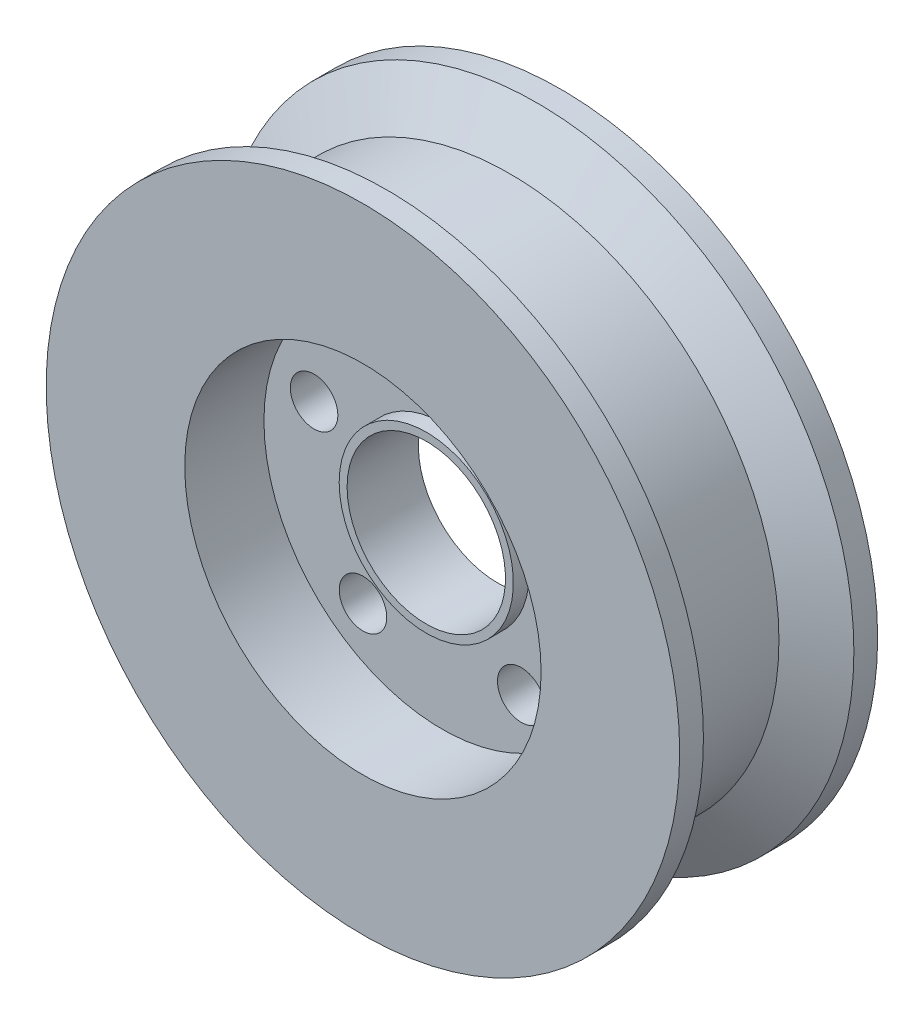
ISO-10303-21;
HEADER;
FILE_DESCRIPTION(('STEP AP214'),'2;1');
FILE_NAME('part.step','',(''),(''),'','','');
FILE_SCHEMA(('AUTOMOTIVE_DESIGN { 1 0 10303 214 1 1 1 1 }'));
ENDSEC;
DATA;
#1=APPLICATION_CONTEXT('core data for automotive mechanical design processes');
#2=APPLICATION_PROTOCOL_DEFINITION('international standard','automotive_design',2000,#1);
#3=PRODUCT_CONTEXT('',#1,'mechanical');
#4=PRODUCT('Part','Part','',(#3));
#5=PRODUCT_RELATED_PRODUCT_CATEGORY('part','',(#4));
#6=PRODUCT_DEFINITION_FORMATION('','',#4);
#7=PRODUCT_DEFINITION_CONTEXT('part definition',#1,'design');
#8=PRODUCT_DEFINITION('design','',#6,#7);
#9=PRODUCT_DEFINITION_SHAPE('','',#8);
#10=(LENGTH_UNIT() NAMED_UNIT(*) SI_UNIT(.MILLI.,.METRE.));
#11=(NAMED_UNIT(*) PLANE_ANGLE_UNIT() SI_UNIT($,.RADIAN.));
#12=(NAMED_UNIT(*) SI_UNIT($,.STERADIAN.) SOLID_ANGLE_UNIT());
#13=UNCERTAINTY_MEASURE_WITH_UNIT(LENGTH_MEASURE(1.E-05),#10,'distance_accuracy_value','');
#14=(GEOMETRIC_REPRESENTATION_CONTEXT(3) GLOBAL_UNCERTAINTY_ASSIGNED_CONTEXT((#13)) GLOBAL_UNIT_ASSIGNED_CONTEXT((#10,
#11,#12)) REPRESENTATION_CONTEXT('',''));
#15=CARTESIAN_POINT('',(0.,0.,0.));
#16=DIRECTION('',(0.,0.,1.));
#17=DIRECTION('',(1.,0.,0.));
#18=AXIS2_PLACEMENT_3D('',#15,#16,#17);
#19=CARTESIAN_POINT('',(0.,0.,12.5));
#20=DIRECTION('',(0.,0.,-1.));
#21=DIRECTION('',(-1.,0.,0.));
#22=AXIS2_PLACEMENT_3D('',#19,#20,#21);
#23=CYLINDRICAL_SURFACE('',#22,40.);
#24=CARTESIAN_POINT('',(0.,0.,-12.5));
#25=DIRECTION('',(0.,0.,1.));
#26=DIRECTION('',(1.,0.,0.));
#27=AXIS2_PLACEMENT_3D('',#24,#25,#26);
#28=CIRCLE('',#27,40.);
#29=CARTESIAN_POINT('',(40.,0.,-12.5));
#30=VERTEX_POINT('',#29);
#31=EDGE_CURVE('E93',#30,#30,#28,.T.);
#32=ORIENTED_EDGE('',*,*,#31,.T.);
#33=EDGE_LOOP('',(#32));
#34=FACE_BOUND('',#33,.T.);
#35=CARTESIAN_POINT('',(0.,0.,-9.5));
#36=DIRECTION('',(0.,0.,1.));
#37=DIRECTION('',(1.,0.,0.));
#38=AXIS2_PLACEMENT_3D('',#35,#36,#37);
#39=CIRCLE('',#38,40.);
#40=CARTESIAN_POINT('',(40.,0.,-9.5));
#41=VERTEX_POINT('',#40);
#42=EDGE_CURVE('E158',#41,#41,#39,.T.);
#43=ORIENTED_EDGE('',*,*,#42,.F.);
#44=EDGE_LOOP('',(#43));
#45=FACE_BOUND('',#44,.T.);
#46=ADVANCED_FACE('F39',(#34,#45),#23,.T.);
#47=CARTESIAN_POINT('',(0.,0.,12.5));
#48=DIRECTION('',(0.,0.,1.));
#49=DIRECTION('',(1.,0.,0.));
#50=AXIS2_PLACEMENT_3D('',#47,#48,#49);
#51=CIRCLE('',#50,40.);
#52=CARTESIAN_POINT('',(40.,0.,12.5));
#53=VERTEX_POINT('',#52);
#54=EDGE_CURVE('E52',#53,#53,#51,.T.);
#55=ORIENTED_EDGE('',*,*,#54,.F.);
#56=EDGE_LOOP('',(#55));
#57=FACE_BOUND('',#56,.T.);
#58=CARTESIAN_POINT('',(0.,0.,9.5));
#59=DIRECTION('',(0.,0.,1.));
#60=DIRECTION('',(1.,0.,0.));
#61=AXIS2_PLACEMENT_3D('',#58,#59,#60);
#62=CIRCLE('',#61,40.);
#63=CARTESIAN_POINT('',(40.,0.,9.5));
#64=VERTEX_POINT('',#63);
#65=EDGE_CURVE('E241',#64,#64,#62,.T.);
#66=ORIENTED_EDGE('',*,*,#65,.T.);
#67=EDGE_LOOP('',(#66));
#68=FACE_BOUND('',#67,.T.);
#69=ADVANCED_FACE('F155',(#57,#68),#23,.T.);
#70=CARTESIAN_POINT('',(0.,0.,12.5));
#71=DIRECTION('',(0.,0.,1.));
#72=DIRECTION('',(1.,0.,0.));
#73=AXIS2_PLACEMENT_3D('',#70,#71,#72);
#74=PLANE('',#73);
#75=CARTESIAN_POINT('',(0.,0.,12.5));
#76=DIRECTION('',(0.,0.,1.));
#77=DIRECTION('',(1.,0.,0.));
#78=AXIS2_PLACEMENT_3D('',#75,#76,#77);
#79=CIRCLE('',#78,22.5);
#80=CARTESIAN_POINT('',(22.5,0.,12.5));
#81=VERTEX_POINT('',#80);
#82=EDGE_CURVE('E84',#81,#81,#79,.T.);
#83=ORIENTED_EDGE('',*,*,#82,.F.);
#84=EDGE_LOOP('',(#83));
#85=FACE_BOUND('',#84,.T.);
#86=ORIENTED_EDGE('',*,*,#54,.T.);
#87=EDGE_LOOP('',(#86));
#88=FACE_BOUND('',#87,.T.);
#89=ADVANCED_FACE('F150',(#85,#88),#74,.T.);
#90=CARTESIAN_POINT('',(0.,0.,-12.5));
#91=DIRECTION('',(0.,0.,1.));
#92=DIRECTION('',(1.,0.,0.));
#93=AXIS2_PLACEMENT_3D('',#90,#91,#92);
#94=PLANE('',#93);
#95=CARTESIAN_POINT('',(0.,0.,-12.5));
#96=DIRECTION('',(0.,0.,1.));
#97=DIRECTION('',(1.,0.,0.));
#98=AXIS2_PLACEMENT_3D('',#95,#96,#97);
#99=CIRCLE('',#98,22.5);
#100=CARTESIAN_POINT('',(22.5,0.,-12.5));
#101=VERTEX_POINT('',#100);
#102=EDGE_CURVE('E85',#101,#101,#99,.T.);
#103=ORIENTED_EDGE('',*,*,#102,.T.);
#104=EDGE_LOOP('',(#103));
#105=FACE_BOUND('',#104,.T.);
#106=ORIENTED_EDGE('',*,*,#31,.F.);
#107=EDGE_LOOP('',(#106));
#108=FACE_BOUND('',#107,.T.);
#109=ADVANCED_FACE('F146',(#105,#108),#94,.F.);
#110=CARTESIAN_POINT('',(0.,0.,2.5));
#111=DIRECTION('',(0.,0.,1.));
#112=DIRECTION('',(1.,0.,0.));
#113=AXIS2_PLACEMENT_3D('',#110,#111,#112);
#114=CYLINDRICAL_SURFACE('',#113,22.5);
#115=CARTESIAN_POINT('',(0.,0.,2.5));
#116=DIRECTION('',(0.,0.,1.));
#117=DIRECTION('',(1.,0.,0.));
#118=AXIS2_PLACEMENT_3D('',#115,#116,#117);
#119=CIRCLE('',#118,22.5);
#120=CARTESIAN_POINT('',(22.5,0.,2.5));
#121=VERTEX_POINT('',#120);
#122=EDGE_CURVE('E89',#121,#121,#119,.T.);
#123=ORIENTED_EDGE('',*,*,#122,.F.);
#124=EDGE_LOOP('',(#123));
#125=FACE_BOUND('',#124,.T.);
#126=ORIENTED_EDGE('',*,*,#82,.T.);
#127=EDGE_LOOP('',(#126));
#128=FACE_BOUND('',#127,.T.);
#129=ADVANCED_FACE('F149',(#125,#128),#114,.F.);
#130=CARTESIAN_POINT('',(0.,0.,2.5));
#131=DIRECTION('',(0.,0.,1.));
#132=DIRECTION('',(1.,0.,0.));
#133=AXIS2_PLACEMENT_3D('',#130,#131,#132);
#134=PLANE('',#133);
#135=CARTESIAN_POINT('',(0.,0.,2.5));
#136=DIRECTION('',(0.,0.,1.));
#137=DIRECTION('',(1.,0.,0.));
#138=AXIS2_PLACEMENT_3D('',#135,#136,#137);
#139=CIRCLE('',#138,11.);
#140=CARTESIAN_POINT('',(11.,0.,2.5));
#141=VERTEX_POINT('',#140);
#142=EDGE_CURVE('E10',#141,#141,#139,.T.);
#143=ORIENTED_EDGE('',*,*,#142,.F.);
#144=EDGE_LOOP('',(#143));
#145=FACE_BOUND('',#144,.T.);
#146=CARTESIAN_POINT('',(-16.1679607770176,5.25328890437406,2.5));
#147=DIRECTION('',(0.,0.,1.));
#148=DIRECTION('',(0.309016994374945,0.951056516295155,0.));
#149=AXIS2_PLACEMENT_3D('',#146,#147,#148);
#150=CIRCLE('',#149,3.);
#151=CARTESIAN_POINT('',(-13.1679607770176,5.25328890437406,2.5));
#152=VERTEX_POINT('',#151);
#153=EDGE_CURVE('E57',#152,#152,#150,.T.);
#154=ORIENTED_EDGE('',*,*,#153,.F.);
#155=EDGE_LOOP('',(#154));
#156=FACE_BOUND('',#155,.T.);
#157=CARTESIAN_POINT('',(-9.99234928897197,-13.7532889043742,2.5));
#158=DIRECTION('',(0.,0.,1.));
#159=DIRECTION('',(-0.809016994374951,0.587785252292469,0.));
#160=AXIS2_PLACEMENT_3D('',#157,#158,#159);
#161=CIRCLE('',#160,3.);
#162=CARTESIAN_POINT('',(-6.99234928897197,-13.7532889043742,2.5));
#163=VERTEX_POINT('',#162);
#164=EDGE_CURVE('E62',#163,#163,#161,.T.);
#165=ORIENTED_EDGE('',*,*,#164,.F.);
#166=EDGE_LOOP('',(#165));
#167=FACE_BOUND('',#166,.T.);
#168=CARTESIAN_POINT('',(9.99234928897216,-13.753288904374,2.5));
#169=DIRECTION('',(0.,0.,1.));
#170=DIRECTION('',(-0.809016994374942,-0.58778525229248,0.));
#171=AXIS2_PLACEMENT_3D('',#168,#169,#170);
#172=CIRCLE('',#171,3.);
#173=CARTESIAN_POINT('',(12.9923492889722,-13.753288904374,2.5));
#174=VERTEX_POINT('',#173);
#175=EDGE_CURVE('E66',#174,#174,#172,.T.);
#176=ORIENTED_EDGE('',*,*,#175,.F.);
#177=EDGE_LOOP('',(#176));
#178=FACE_BOUND('',#177,.T.);
#179=CARTESIAN_POINT('',(16.1679607770176,5.25328890437429,2.5));
#180=DIRECTION('',(0.,0.,1.));
#181=DIRECTION('',(0.309016994374958,-0.95105651629515,0.));
#182=AXIS2_PLACEMENT_3D('',#179,#180,#181);
#183=CIRCLE('',#182,3.);
#184=CARTESIAN_POINT('',(19.1679607770176,5.25328890437429,2.5));
#185=VERTEX_POINT('',#184);
#186=EDGE_CURVE('E70',#185,#185,#183,.T.);
#187=ORIENTED_EDGE('',*,*,#186,.F.);
#188=EDGE_LOOP('',(#187));
#189=FACE_BOUND('',#188,.T.);
#190=CARTESIAN_POINT('',(0.,17.,2.5));
#191=DIRECTION('',(0.,0.,1.));
#192=DIRECTION('',(1.,0.,0.));
#193=AXIS2_PLACEMENT_3D('',#190,#191,#192);
#194=CIRCLE('',#193,3.);
#195=CARTESIAN_POINT('',(3.,17.,2.5));
#196=VERTEX_POINT('',#195);
#197=EDGE_CURVE('E74',#196,#196,#194,.T.);
#198=ORIENTED_EDGE('',*,*,#197,.F.);
#199=EDGE_LOOP('',(#198));
#200=FACE_BOUND('',#199,.T.);
#201=ORIENTED_EDGE('',*,*,#122,.T.);
#202=EDGE_LOOP('',(#201));
#203=FACE_BOUND('',#202,.T.);
#204=ADVANCED_FACE('F142',(#145,#156,#167,#178,#189,#200,#203),#134,.T.);
#205=CARTESIAN_POINT('',(0.,0.,-2.5));
#206=DIRECTION('',(0.,0.,-1.));
#207=DIRECTION('',(-1.,0.,0.));
#208=AXIS2_PLACEMENT_3D('',#205,#206,#207);
#209=CYLINDRICAL_SURFACE('',#208,22.5);
#210=CARTESIAN_POINT('',(0.,0.,-2.5));
#211=DIRECTION('',(0.,0.,1.));
#212=DIRECTION('',(1.,0.,0.));
#213=AXIS2_PLACEMENT_3D('',#210,#211,#212);
#214=CIRCLE('',#213,22.5);
#215=CARTESIAN_POINT('',(22.5,0.,-2.5));
#216=VERTEX_POINT('',#215);
#217=EDGE_CURVE('E80',#216,#216,#214,.T.);
#218=ORIENTED_EDGE('',*,*,#217,.T.);
#219=EDGE_LOOP('',(#218));
#220=FACE_BOUND('',#219,.T.);
#221=ORIENTED_EDGE('',*,*,#102,.F.);
#222=EDGE_LOOP('',(#221));
#223=FACE_BOUND('',#222,.T.);
#224=ADVANCED_FACE('F127',(#220,#223),#209,.F.);
#225=CARTESIAN_POINT('',(0.,0.,-2.5));
#226=DIRECTION('',(0.,0.,-1.));
#227=DIRECTION('',(1.,0.,0.));
#228=AXIS2_PLACEMENT_3D('',#225,#226,#227);
#229=PLANE('',#228);
#230=CARTESIAN_POINT('',(0.,0.,-2.5));
#231=DIRECTION('',(0.,0.,-1.));
#232=DIRECTION('',(-1.,0.,0.));
#233=AXIS2_PLACEMENT_3D('',#230,#231,#232);
#234=CIRCLE('',#233,11.);
#235=CARTESIAN_POINT('',(-11.,0.,-2.5));
#236=VERTEX_POINT('',#235);
#237=EDGE_CURVE('E42',#236,#236,#234,.T.);
#238=ORIENTED_EDGE('',*,*,#237,.F.);
#239=EDGE_LOOP('',(#238));
#240=FACE_BOUND('',#239,.T.);
#241=CARTESIAN_POINT('',(-16.1679607770176,5.25328890437406,-2.5));
#242=DIRECTION('',(0.,0.,-1.));
#243=DIRECTION('',(-1.,0.,0.));
#244=AXIS2_PLACEMENT_3D('',#241,#242,#243);
#245=CIRCLE('',#244,3.);
#246=CARTESIAN_POINT('',(-13.1679607770176,5.25328890437406,-2.5));
#247=VERTEX_POINT('',#246);
#248=EDGE_CURVE('E79',#247,#247,#245,.T.);
#249=ORIENTED_EDGE('',*,*,#248,.F.);
#250=EDGE_LOOP('',(#249));
#251=FACE_BOUND('',#250,.T.);
#252=CARTESIAN_POINT('',(-9.99234928897197,-13.7532889043742,-2.5));
#253=DIRECTION('',(0.,0.,-1.));
#254=DIRECTION('',(-1.,0.,0.));
#255=AXIS2_PLACEMENT_3D('',#252,#253,#254);
#256=CIRCLE('',#255,3.);
#257=CARTESIAN_POINT('',(-6.99234928897197,-13.7532889043742,-2.5));
#258=VERTEX_POINT('',#257);
#259=EDGE_CURVE('E113',#258,#258,#256,.T.);
#260=ORIENTED_EDGE('',*,*,#259,.F.);
#261=EDGE_LOOP('',(#260));
#262=FACE_BOUND('',#261,.T.);
#263=CARTESIAN_POINT('',(9.99234928897216,-13.753288904374,-2.5));
#264=DIRECTION('',(0.,0.,-1.));
#265=DIRECTION('',(-1.,0.,0.));
#266=AXIS2_PLACEMENT_3D('',#263,#264,#265);
#267=CIRCLE('',#266,3.);
#268=CARTESIAN_POINT('',(12.9923492889722,-13.753288904374,-2.5));
#269=VERTEX_POINT('',#268);
#270=EDGE_CURVE('E109',#269,#269,#267,.T.);
#271=ORIENTED_EDGE('',*,*,#270,.F.);
#272=EDGE_LOOP('',(#271));
#273=FACE_BOUND('',#272,.T.);
#274=CARTESIAN_POINT('',(16.1679607770176,5.25328890437429,-2.5));
#275=DIRECTION('',(0.,0.,-1.));
#276=DIRECTION('',(-1.,0.,0.));
#277=AXIS2_PLACEMENT_3D('',#274,#275,#276);
#278=CIRCLE('',#277,3.);
#279=CARTESIAN_POINT('',(19.1679607770176,5.25328890437429,-2.5));
#280=VERTEX_POINT('',#279);
#281=EDGE_CURVE('E61',#280,#280,#278,.T.);
#282=ORIENTED_EDGE('',*,*,#281,.F.);
#283=EDGE_LOOP('',(#282));
#284=FACE_BOUND('',#283,.T.);
#285=CARTESIAN_POINT('',(0.,17.,-2.5));
#286=DIRECTION('',(0.,0.,-1.));
#287=DIRECTION('',(-1.,0.,0.));
#288=AXIS2_PLACEMENT_3D('',#285,#286,#287);
#289=CIRCLE('',#288,3.);
#290=CARTESIAN_POINT('',(3.,17.,-2.5));
#291=VERTEX_POINT('',#290);
#292=EDGE_CURVE('E78',#291,#291,#289,.T.);
#293=ORIENTED_EDGE('',*,*,#292,.F.);
#294=EDGE_LOOP('',(#293));
#295=FACE_BOUND('',#294,.T.);
#296=ORIENTED_EDGE('',*,*,#217,.F.);
#297=EDGE_LOOP('',(#296));
#298=FACE_BOUND('',#297,.T.);
#299=ADVANCED_FACE('F123',(#240,#251,#262,#273,#284,#295,#298),#229,.T.);
#300=CARTESIAN_POINT('',(0.,17.,-12.5));
#301=DIRECTION('',(0.,0.,1.));
#302=DIRECTION('',(1.,0.,0.));
#303=AXIS2_PLACEMENT_3D('',#300,#301,#302);
#304=CYLINDRICAL_SURFACE('',#303,3.);
#305=CARTESIAN_POINT('',(3.,17.,-2.5));
#306=CARTESIAN_POINT('',(3.,17.,-2.44791666666667));
#307=CARTESIAN_POINT('',(3.,17.,-2.39583333333333));
#308=CARTESIAN_POINT('',(3.,17.,-2.29166666666667));
#309=CARTESIAN_POINT('',(3.,17.,-2.23958333333333));
#310=CARTESIAN_POINT('',(3.,17.,-2.13541666666667));
#311=CARTESIAN_POINT('',(3.,17.,-2.08333333333333));
#312=CARTESIAN_POINT('',(3.,17.,-1.97916666666667));
#313=CARTESIAN_POINT('',(3.,17.,-1.92708333333333));
#314=CARTESIAN_POINT('',(3.,17.,-1.82291666666667));
#315=CARTESIAN_POINT('',(3.,17.,-1.77083333333333));
#316=CARTESIAN_POINT('',(3.,17.,-1.66666666666667));
#317=CARTESIAN_POINT('',(3.,17.,-1.61458333333333));
#318=CARTESIAN_POINT('',(3.,17.,-1.51041666666667));
#319=CARTESIAN_POINT('',(3.,17.,-1.45833333333333));
#320=CARTESIAN_POINT('',(3.,17.,-1.35416666666667));
#321=CARTESIAN_POINT('',(3.,17.,-1.30208333333333));
#322=CARTESIAN_POINT('',(3.,17.,-1.19791666666667));
#323=CARTESIAN_POINT('',(3.,17.,-1.14583333333333));
#324=CARTESIAN_POINT('',(3.,17.,-1.04166666666667));
#325=CARTESIAN_POINT('',(3.,17.,-0.989583333333334));
#326=CARTESIAN_POINT('',(3.,17.,-0.885416666666668));
#327=CARTESIAN_POINT('',(3.,17.,-0.833333333333334));
#328=CARTESIAN_POINT('',(3.,17.,-0.729166666666667));
#329=CARTESIAN_POINT('',(3.,17.,-0.677083333333334));
#330=CARTESIAN_POINT('',(3.,17.,-0.572916666666667));
#331=CARTESIAN_POINT('',(3.,17.,-0.520833333333334));
#332=CARTESIAN_POINT('',(3.,17.,-0.416666666666667));
#333=CARTESIAN_POINT('',(3.,17.,-0.364583333333334));
#334=CARTESIAN_POINT('',(3.,17.,-0.260416666666667));
#335=CARTESIAN_POINT('',(3.,17.,-0.208333333333334));
#336=CARTESIAN_POINT('',(3.,17.,-0.104166666666667));
#337=CARTESIAN_POINT('',(3.,17.,-0.0520833333333334));
#338=CARTESIAN_POINT('',(3.,17.,0.0520833333333334));
#339=CARTESIAN_POINT('',(3.,17.,0.104166666666667));
#340=CARTESIAN_POINT('',(3.,17.,0.208333333333334));
#341=CARTESIAN_POINT('',(3.,17.,0.260416666666667));
#342=CARTESIAN_POINT('',(3.,17.,0.364583333333334));
#343=CARTESIAN_POINT('',(3.,17.,0.416666666666667));
#344=CARTESIAN_POINT('',(3.,17.,0.520833333333334));
#345=CARTESIAN_POINT('',(3.,17.,0.572916666666667));
#346=CARTESIAN_POINT('',(3.,17.,0.677083333333334));
#347=CARTESIAN_POINT('',(3.,17.,0.729166666666667));
#348=CARTESIAN_POINT('',(3.,17.,0.833333333333333));
#349=CARTESIAN_POINT('',(3.,17.,0.885416666666666));
#350=CARTESIAN_POINT('',(3.,17.,0.989583333333333));
#351=CARTESIAN_POINT('',(3.,17.,1.04166666666667));
#352=CARTESIAN_POINT('',(3.,17.,1.14583333333333));
#353=CARTESIAN_POINT('',(3.,17.,1.19791666666667));
#354=CARTESIAN_POINT('',(3.,17.,1.30208333333333));
#355=CARTESIAN_POINT('',(3.,17.,1.35416666666667));
#356=CARTESIAN_POINT('',(3.,17.,1.45833333333333));
#357=CARTESIAN_POINT('',(3.,17.,1.51041666666667));
#358=CARTESIAN_POINT('',(3.,17.,1.61458333333333));
#359=CARTESIAN_POINT('',(3.,17.,1.66666666666667));
#360=CARTESIAN_POINT('',(3.,17.,1.77083333333333));
#361=CARTESIAN_POINT('',(3.,17.,1.82291666666667));
#362=CARTESIAN_POINT('',(3.,17.,1.92708333333333));
#363=CARTESIAN_POINT('',(3.,17.,1.97916666666667));
#364=CARTESIAN_POINT('',(3.,17.,2.08333333333333));
#365=CARTESIAN_POINT('',(3.,17.,2.13541666666667));
#366=CARTESIAN_POINT('',(3.,17.,2.23958333333333));
#367=CARTESIAN_POINT('',(3.,17.,2.29166666666667));
#368=CARTESIAN_POINT('',(3.,17.,2.39583333333333));
#369=CARTESIAN_POINT('',(3.,17.,2.44791666666667));
#370=CARTESIAN_POINT('',(3.,17.,2.5));
#371=B_SPLINE_CURVE_WITH_KNOTS('',3,(#305,#306,#307,#308,#309,#310,#311,#312,#313,#314,#315,
#316,#317,#318,#319,#320,#321,#322,#323,#324,#325,#326,#327,#328,#329,#330,#331,#332,#333,#334,
#335,#336,#337,#338,#339,#340,#341,#342,#343,#344,#345,#346,#347,#348,#349,#350,#351,#352,#353,
#354,#355,#356,#357,#358,#359,#360,#361,#362,#363,#364,#365,#366,#367,#368,#369,#370),
.UNSPECIFIED.,.F.,.F.,(4,2,2,2,2,2,2,2,2,2,2,2,2,2,2,2,2,2,2,2,2,2,2,2,2,2,2,2,2,2,2,2,4),(0.,
0.15625,0.3125,0.46875,0.625000000000001,0.781250000000001,0.937500000000001,1.09375,1.25,
1.40625,1.5625,1.71875,1.875,2.03125,2.1875,2.34375,2.5,2.65625,2.8125,2.96875,3.125,3.28125,
3.4375,3.59375,3.75,3.90625,4.0625,4.21875,4.375,4.53125,4.6875,4.84375,5.),.UNSPECIFIED.);
#372=EDGE_CURVE('BSEAM126',#291,#196,#371,.T.);
#373=ORIENTED_EDGE('',*,*,#292,.T.);
#374=ORIENTED_EDGE('',*,*,#197,.T.);
#375=ORIENTED_EDGE('',*,*,#372,.T.);
#376=ORIENTED_EDGE('',*,*,#372,.F.);
#377=EDGE_LOOP('',(#373,#375,#374,#376));
#378=FACE_BOUND('',#377,.T.);
#379=ADVANCED_FACE('F126',(#378),#304,.F.);
#380=CARTESIAN_POINT('',(16.1679607770176,5.25328890437429,-12.5));
#381=DIRECTION('',(0.,0.,1.));
#382=DIRECTION('',(1.,0.,0.));
#383=AXIS2_PLACEMENT_3D('',#380,#381,#382);
#384=CYLINDRICAL_SURFACE('',#383,3.);
#385=CARTESIAN_POINT('',(19.1679607770176,5.25328890437429,-2.5));
#386=CARTESIAN_POINT('',(19.1679607770176,5.25328890437429,-2.44791666666667));
#387=CARTESIAN_POINT('',(19.1679607770176,5.25328890437429,-2.39583333333333));
#388=CARTESIAN_POINT('',(19.1679607770176,5.25328890437429,-2.29166666666667));
#389=CARTESIAN_POINT('',(19.1679607770176,5.25328890437429,-2.23958333333333));
#390=CARTESIAN_POINT('',(19.1679607770176,5.25328890437429,-2.13541666666667));
#391=CARTESIAN_POINT('',(19.1679607770176,5.25328890437429,-2.08333333333333));
#392=CARTESIAN_POINT('',(19.1679607770176,5.25328890437429,-1.97916666666667));
#393=CARTESIAN_POINT('',(19.1679607770176,5.25328890437429,-1.92708333333333));
#394=CARTESIAN_POINT('',(19.1679607770176,5.25328890437429,-1.82291666666667));
#395=CARTESIAN_POINT('',(19.1679607770176,5.25328890437429,-1.77083333333333));
#396=CARTESIAN_POINT('',(19.1679607770176,5.25328890437429,-1.66666666666667));
#397=CARTESIAN_POINT('',(19.1679607770176,5.25328890437429,-1.61458333333333));
#398=CARTESIAN_POINT('',(19.1679607770176,5.25328890437429,-1.51041666666667));
#399=CARTESIAN_POINT('',(19.1679607770176,5.25328890437429,-1.45833333333333));
#400=CARTESIAN_POINT('',(19.1679607770176,5.25328890437429,-1.35416666666667));
#401=CARTESIAN_POINT('',(19.1679607770176,5.25328890437429,-1.30208333333333));
#402=CARTESIAN_POINT('',(19.1679607770176,5.25328890437429,-1.19791666666667));
#403=CARTESIAN_POINT('',(19.1679607770176,5.25328890437429,-1.14583333333333));
#404=CARTESIAN_POINT('',(19.1679607770176,5.25328890437429,-1.04166666666667));
#405=CARTESIAN_POINT('',(19.1679607770176,5.25328890437429,-0.989583333333334));
#406=CARTESIAN_POINT('',(19.1679607770176,5.25328890437429,-0.885416666666668));
#407=CARTESIAN_POINT('',(19.1679607770176,5.25328890437429,-0.833333333333334));
#408=CARTESIAN_POINT('',(19.1679607770176,5.25328890437429,-0.729166666666667));
#409=CARTESIAN_POINT('',(19.1679607770176,5.25328890437429,-0.677083333333334));
#410=CARTESIAN_POINT('',(19.1679607770176,5.25328890437429,-0.572916666666667));
#411=CARTESIAN_POINT('',(19.1679607770176,5.25328890437429,-0.520833333333334));
#412=CARTESIAN_POINT('',(19.1679607770176,5.25328890437429,-0.416666666666667));
#413=CARTESIAN_POINT('',(19.1679607770176,5.25328890437429,-0.364583333333334));
#414=CARTESIAN_POINT('',(19.1679607770176,5.25328890437429,-0.260416666666667));
#415=CARTESIAN_POINT('',(19.1679607770176,5.25328890437429,-0.208333333333334));
#416=CARTESIAN_POINT('',(19.1679607770176,5.25328890437429,-0.104166666666667));
#417=CARTESIAN_POINT('',(19.1679607770176,5.25328890437429,-0.0520833333333334));
#418=CARTESIAN_POINT('',(19.1679607770176,5.25328890437429,0.0520833333333334));
#419=CARTESIAN_POINT('',(19.1679607770176,5.25328890437429,0.104166666666667));
#420=CARTESIAN_POINT('',(19.1679607770176,5.25328890437429,0.208333333333334));
#421=CARTESIAN_POINT('',(19.1679607770176,5.25328890437429,0.260416666666667));
#422=CARTESIAN_POINT('',(19.1679607770176,5.25328890437429,0.364583333333334));
#423=CARTESIAN_POINT('',(19.1679607770176,5.25328890437429,0.416666666666667));
#424=CARTESIAN_POINT('',(19.1679607770176,5.25328890437429,0.520833333333334));
#425=CARTESIAN_POINT('',(19.1679607770176,5.25328890437429,0.572916666666667));
#426=CARTESIAN_POINT('',(19.1679607770176,5.25328890437429,0.677083333333334));
#427=CARTESIAN_POINT('',(19.1679607770176,5.25328890437429,0.729166666666667));
#428=CARTESIAN_POINT('',(19.1679607770176,5.25328890437429,0.833333333333333));
#429=CARTESIAN_POINT('',(19.1679607770176,5.25328890437429,0.885416666666666));
#430=CARTESIAN_POINT('',(19.1679607770176,5.25328890437429,0.989583333333333));
#431=CARTESIAN_POINT('',(19.1679607770176,5.25328890437429,1.04166666666667));
#432=CARTESIAN_POINT('',(19.1679607770176,5.25328890437429,1.14583333333333));
#433=CARTESIAN_POINT('',(19.1679607770176,5.25328890437429,1.19791666666667));
#434=CARTESIAN_POINT('',(19.1679607770176,5.25328890437429,1.30208333333333));
#435=CARTESIAN_POINT('',(19.1679607770176,5.25328890437429,1.35416666666667));
#436=CARTESIAN_POINT('',(19.1679607770176,5.25328890437429,1.45833333333333));
#437=CARTESIAN_POINT('',(19.1679607770176,5.25328890437429,1.51041666666667));
#438=CARTESIAN_POINT('',(19.1679607770176,5.25328890437429,1.61458333333333));
#439=CARTESIAN_POINT('',(19.1679607770176,5.25328890437429,1.66666666666667));
#440=CARTESIAN_POINT('',(19.1679607770176,5.25328890437429,1.77083333333333));
#441=CARTESIAN_POINT('',(19.1679607770176,5.25328890437429,1.82291666666667));
#442=CARTESIAN_POINT('',(19.1679607770176,5.25328890437429,1.92708333333333));
#443=CARTESIAN_POINT('',(19.1679607770176,5.25328890437429,1.97916666666667));
#444=CARTESIAN_POINT('',(19.1679607770176,5.25328890437429,2.08333333333333));
#445=CARTESIAN_POINT('',(19.1679607770176,5.25328890437429,2.13541666666667));
#446=CARTESIAN_POINT('',(19.1679607770176,5.25328890437429,2.23958333333333));
#447=CARTESIAN_POINT('',(19.1679607770176,5.25328890437429,2.29166666666667));
#448=CARTESIAN_POINT('',(19.1679607770176,5.25328890437429,2.39583333333333));
#449=CARTESIAN_POINT('',(19.1679607770176,5.25328890437429,2.44791666666667));
#450=CARTESIAN_POINT('',(19.1679607770176,5.25328890437429,2.5));
#451=B_SPLINE_CURVE_WITH_KNOTS('',3,(#385,#386,#387,#388,#389,#390,#391,#392,#393,#394,#395,
#396,#397,#398,#399,#400,#401,#402,#403,#404,#405,#406,#407,#408,#409,#410,#411,#412,#413,#414,
#415,#416,#417,#418,#419,#420,#421,#422,#423,#424,#425,#426,#427,#428,#429,#430,#431,#432,#433,
#434,#435,#436,#437,#438,#439,#440,#441,#442,#443,#444,#445,#446,#447,#448,#449,#450),
.UNSPECIFIED.,.F.,.F.,(4,2,2,2,2,2,2,2,2,2,2,2,2,2,2,2,2,2,2,2,2,2,2,2,2,2,2,2,2,2,2,2,4),(0.,
0.15625,0.3125,0.46875,0.625000000000001,0.781250000000001,0.937500000000001,1.09375,1.25,
1.40625,1.5625,1.71875,1.875,2.03125,2.1875,2.34375,2.5,2.65625,2.8125,2.96875,3.125,3.28125,
3.4375,3.59375,3.75,3.90625,4.0625,4.21875,4.375,4.53125,4.6875,4.84375,5.),.UNSPECIFIED.);
#452=EDGE_CURVE('BSEAM215',#280,#185,#451,.T.);
#453=ORIENTED_EDGE('',*,*,#281,.T.);
#454=ORIENTED_EDGE('',*,*,#186,.T.);
#455=ORIENTED_EDGE('',*,*,#452,.T.);
#456=ORIENTED_EDGE('',*,*,#452,.F.);
#457=EDGE_LOOP('',(#453,#455,#454,#456));
#458=FACE_BOUND('',#457,.T.);
#459=ADVANCED_FACE('F215',(#458),#384,.F.);
#460=CARTESIAN_POINT('',(9.99234928897216,-13.753288904374,-12.5));
#461=DIRECTION('',(0.,0.,1.));
#462=DIRECTION('',(1.,0.,0.));
#463=AXIS2_PLACEMENT_3D('',#460,#461,#462);
#464=CYLINDRICAL_SURFACE('',#463,3.);
#465=CARTESIAN_POINT('',(12.9923492889722,-13.753288904374,-2.5));
#466=CARTESIAN_POINT('',(12.9923492889722,-13.753288904374,-2.44791666666667));
#467=CARTESIAN_POINT('',(12.9923492889722,-13.753288904374,-2.39583333333333));
#468=CARTESIAN_POINT('',(12.9923492889722,-13.753288904374,-2.29166666666667));
#469=CARTESIAN_POINT('',(12.9923492889722,-13.753288904374,-2.23958333333333));
#470=CARTESIAN_POINT('',(12.9923492889722,-13.753288904374,-2.13541666666667));
#471=CARTESIAN_POINT('',(12.9923492889722,-13.753288904374,-2.08333333333333));
#472=CARTESIAN_POINT('',(12.9923492889722,-13.753288904374,-1.97916666666667));
#473=CARTESIAN_POINT('',(12.9923492889722,-13.753288904374,-1.92708333333333));
#474=CARTESIAN_POINT('',(12.9923492889722,-13.753288904374,-1.82291666666667));
#475=CARTESIAN_POINT('',(12.9923492889722,-13.753288904374,-1.77083333333333));
#476=CARTESIAN_POINT('',(12.9923492889722,-13.753288904374,-1.66666666666667));
#477=CARTESIAN_POINT('',(12.9923492889722,-13.753288904374,-1.61458333333333));
#478=CARTESIAN_POINT('',(12.9923492889722,-13.753288904374,-1.51041666666667));
#479=CARTESIAN_POINT('',(12.9923492889722,-13.753288904374,-1.45833333333333));
#480=CARTESIAN_POINT('',(12.9923492889722,-13.753288904374,-1.35416666666667));
#481=CARTESIAN_POINT('',(12.9923492889722,-13.753288904374,-1.30208333333333));
#482=CARTESIAN_POINT('',(12.9923492889722,-13.753288904374,-1.19791666666667));
#483=CARTESIAN_POINT('',(12.9923492889722,-13.753288904374,-1.14583333333333));
#484=CARTESIAN_POINT('',(12.9923492889722,-13.753288904374,-1.04166666666667));
#485=CARTESIAN_POINT('',(12.9923492889722,-13.753288904374,-0.989583333333334));
#486=CARTESIAN_POINT('',(12.9923492889722,-13.753288904374,-0.885416666666668));
#487=CARTESIAN_POINT('',(12.9923492889722,-13.753288904374,-0.833333333333334));
#488=CARTESIAN_POINT('',(12.9923492889722,-13.753288904374,-0.729166666666667));
#489=CARTESIAN_POINT('',(12.9923492889722,-13.753288904374,-0.677083333333334));
#490=CARTESIAN_POINT('',(12.9923492889722,-13.753288904374,-0.572916666666667));
#491=CARTESIAN_POINT('',(12.9923492889722,-13.753288904374,-0.520833333333334));
#492=CARTESIAN_POINT('',(12.9923492889722,-13.753288904374,-0.416666666666667));
#493=CARTESIAN_POINT('',(12.9923492889722,-13.753288904374,-0.364583333333334));
#494=CARTESIAN_POINT('',(12.9923492889722,-13.753288904374,-0.260416666666667));
#495=CARTESIAN_POINT('',(12.9923492889722,-13.753288904374,-0.208333333333334));
#496=CARTESIAN_POINT('',(12.9923492889722,-13.753288904374,-0.104166666666667));
#497=CARTESIAN_POINT('',(12.9923492889722,-13.753288904374,-0.0520833333333334));
#498=CARTESIAN_POINT('',(12.9923492889722,-13.753288904374,0.0520833333333334));
#499=CARTESIAN_POINT('',(12.9923492889722,-13.753288904374,0.104166666666667));
#500=CARTESIAN_POINT('',(12.9923492889722,-13.753288904374,0.208333333333334));
#501=CARTESIAN_POINT('',(12.9923492889722,-13.753288904374,0.260416666666667));
#502=CARTESIAN_POINT('',(12.9923492889722,-13.753288904374,0.364583333333334));
#503=CARTESIAN_POINT('',(12.9923492889722,-13.753288904374,0.416666666666667));
#504=CARTESIAN_POINT('',(12.9923492889722,-13.753288904374,0.520833333333334));
#505=CARTESIAN_POINT('',(12.9923492889722,-13.753288904374,0.572916666666667));
#506=CARTESIAN_POINT('',(12.9923492889722,-13.753288904374,0.677083333333334));
#507=CARTESIAN_POINT('',(12.9923492889722,-13.753288904374,0.729166666666667));
#508=CARTESIAN_POINT('',(12.9923492889722,-13.753288904374,0.833333333333333));
#509=CARTESIAN_POINT('',(12.9923492889722,-13.753288904374,0.885416666666666));
#510=CARTESIAN_POINT('',(12.9923492889722,-13.753288904374,0.989583333333333));
#511=CARTESIAN_POINT('',(12.9923492889722,-13.753288904374,1.04166666666667));
#512=CARTESIAN_POINT('',(12.9923492889722,-13.753288904374,1.14583333333333));
#513=CARTESIAN_POINT('',(12.9923492889722,-13.753288904374,1.19791666666667));
#514=CARTESIAN_POINT('',(12.9923492889722,-13.753288904374,1.30208333333333));
#515=CARTESIAN_POINT('',(12.9923492889722,-13.753288904374,1.35416666666667));
#516=CARTESIAN_POINT('',(12.9923492889722,-13.753288904374,1.45833333333333));
#517=CARTESIAN_POINT('',(12.9923492889722,-13.753288904374,1.51041666666667));
#518=CARTESIAN_POINT('',(12.9923492889722,-13.753288904374,1.61458333333333));
#519=CARTESIAN_POINT('',(12.9923492889722,-13.753288904374,1.66666666666667));
#520=CARTESIAN_POINT('',(12.9923492889722,-13.753288904374,1.77083333333333));
#521=CARTESIAN_POINT('',(12.9923492889722,-13.753288904374,1.82291666666667));
#522=CARTESIAN_POINT('',(12.9923492889722,-13.753288904374,1.92708333333333));
#523=CARTESIAN_POINT('',(12.9923492889722,-13.753288904374,1.97916666666667));
#524=CARTESIAN_POINT('',(12.9923492889722,-13.753288904374,2.08333333333333));
#525=CARTESIAN_POINT('',(12.9923492889722,-13.753288904374,2.13541666666667));
#526=CARTESIAN_POINT('',(12.9923492889722,-13.753288904374,2.23958333333333));
#527=CARTESIAN_POINT('',(12.9923492889722,-13.753288904374,2.29166666666667));
#528=CARTESIAN_POINT('',(12.9923492889722,-13.753288904374,2.39583333333333));
#529=CARTESIAN_POINT('',(12.9923492889722,-13.753288904374,2.44791666666667));
#530=CARTESIAN_POINT('',(12.9923492889722,-13.753288904374,2.5));
#531=B_SPLINE_CURVE_WITH_KNOTS('',3,(#465,#466,#467,#468,#469,#470,#471,#472,#473,#474,#475,
#476,#477,#478,#479,#480,#481,#482,#483,#484,#485,#486,#487,#488,#489,#490,#491,#492,#493,#494,
#495,#496,#497,#498,#499,#500,#501,#502,#503,#504,#505,#506,#507,#508,#509,#510,#511,#512,#513,
#514,#515,#516,#517,#518,#519,#520,#521,#522,#523,#524,#525,#526,#527,#528,#529,#530),
.UNSPECIFIED.,.F.,.F.,(4,2,2,2,2,2,2,2,2,2,2,2,2,2,2,2,2,2,2,2,2,2,2,2,2,2,2,2,2,2,2,2,4),(0.,
0.15625,0.3125,0.46875,0.625000000000001,0.781250000000001,0.937500000000001,1.09375,1.25,
1.40625,1.5625,1.71875,1.875,2.03125,2.1875,2.34375,2.5,2.65625,2.8125,2.96875,3.125,3.28125,
3.4375,3.59375,3.75,3.90625,4.0625,4.21875,4.375,4.53125,4.6875,4.84375,5.),.UNSPECIFIED.);
#532=EDGE_CURVE('BSEAM211',#269,#174,#531,.T.);
#533=ORIENTED_EDGE('',*,*,#270,.T.);
#534=ORIENTED_EDGE('',*,*,#175,.T.);
#535=ORIENTED_EDGE('',*,*,#532,.T.);
#536=ORIENTED_EDGE('',*,*,#532,.F.);
#537=EDGE_LOOP('',(#533,#535,#534,#536));
#538=FACE_BOUND('',#537,.T.);
#539=ADVANCED_FACE('F211',(#538),#464,.F.);
#540=CARTESIAN_POINT('',(-9.99234928897197,-13.7532889043742,-12.5));
#541=DIRECTION('',(0.,0.,1.));
#542=DIRECTION('',(1.,0.,0.));
#543=AXIS2_PLACEMENT_3D('',#540,#541,#542);
#544=CYLINDRICAL_SURFACE('',#543,3.);
#545=CARTESIAN_POINT('',(-6.99234928897197,-13.7532889043742,-2.5));
#546=CARTESIAN_POINT('',(-6.99234928897197,-13.7532889043742,-2.44791666666667));
#547=CARTESIAN_POINT('',(-6.99234928897197,-13.7532889043742,-2.39583333333333));
#548=CARTESIAN_POINT('',(-6.99234928897197,-13.7532889043742,-2.29166666666667));
#549=CARTESIAN_POINT('',(-6.99234928897197,-13.7532889043742,-2.23958333333333));
#550=CARTESIAN_POINT('',(-6.99234928897197,-13.7532889043742,-2.13541666666667));
#551=CARTESIAN_POINT('',(-6.99234928897197,-13.7532889043742,-2.08333333333333));
#552=CARTESIAN_POINT('',(-6.99234928897197,-13.7532889043742,-1.97916666666667));
#553=CARTESIAN_POINT('',(-6.99234928897197,-13.7532889043742,-1.92708333333333));
#554=CARTESIAN_POINT('',(-6.99234928897197,-13.7532889043742,-1.82291666666667));
#555=CARTESIAN_POINT('',(-6.99234928897197,-13.7532889043742,-1.77083333333333));
#556=CARTESIAN_POINT('',(-6.99234928897197,-13.7532889043742,-1.66666666666667));
#557=CARTESIAN_POINT('',(-6.99234928897197,-13.7532889043742,-1.61458333333333));
#558=CARTESIAN_POINT('',(-6.99234928897197,-13.7532889043742,-1.51041666666667));
#559=CARTESIAN_POINT('',(-6.99234928897197,-13.7532889043742,-1.45833333333333));
#560=CARTESIAN_POINT('',(-6.99234928897197,-13.7532889043742,-1.35416666666667));
#561=CARTESIAN_POINT('',(-6.99234928897197,-13.7532889043742,-1.30208333333333));
#562=CARTESIAN_POINT('',(-6.99234928897197,-13.7532889043742,-1.19791666666667));
#563=CARTESIAN_POINT('',(-6.99234928897197,-13.7532889043742,-1.14583333333333));
#564=CARTESIAN_POINT('',(-6.99234928897197,-13.7532889043742,-1.04166666666667));
#565=CARTESIAN_POINT('',(-6.99234928897197,-13.7532889043742,-0.989583333333334));
#566=CARTESIAN_POINT('',(-6.99234928897197,-13.7532889043742,-0.885416666666668));
#567=CARTESIAN_POINT('',(-6.99234928897197,-13.7532889043742,-0.833333333333334));
#568=CARTESIAN_POINT('',(-6.99234928897197,-13.7532889043742,-0.729166666666667));
#569=CARTESIAN_POINT('',(-6.99234928897197,-13.7532889043742,-0.677083333333334));
#570=CARTESIAN_POINT('',(-6.99234928897197,-13.7532889043742,-0.572916666666667));
#571=CARTESIAN_POINT('',(-6.99234928897197,-13.7532889043742,-0.520833333333334));
#572=CARTESIAN_POINT('',(-6.99234928897197,-13.7532889043742,-0.416666666666667));
#573=CARTESIAN_POINT('',(-6.99234928897197,-13.7532889043742,-0.364583333333334));
#574=CARTESIAN_POINT('',(-6.99234928897197,-13.7532889043742,-0.260416666666667));
#575=CARTESIAN_POINT('',(-6.99234928897197,-13.7532889043742,-0.208333333333334));
#576=CARTESIAN_POINT('',(-6.99234928897197,-13.7532889043742,-0.104166666666667));
#577=CARTESIAN_POINT('',(-6.99234928897197,-13.7532889043742,-0.0520833333333334));
#578=CARTESIAN_POINT('',(-6.99234928897197,-13.7532889043742,0.0520833333333334));
#579=CARTESIAN_POINT('',(-6.99234928897197,-13.7532889043742,0.104166666666667));
#580=CARTESIAN_POINT('',(-6.99234928897197,-13.7532889043742,0.208333333333334));
#581=CARTESIAN_POINT('',(-6.99234928897197,-13.7532889043742,0.260416666666667));
#582=CARTESIAN_POINT('',(-6.99234928897197,-13.7532889043742,0.364583333333334));
#583=CARTESIAN_POINT('',(-6.99234928897197,-13.7532889043742,0.416666666666667));
#584=CARTESIAN_POINT('',(-6.99234928897197,-13.7532889043742,0.520833333333334));
#585=CARTESIAN_POINT('',(-6.99234928897197,-13.7532889043742,0.572916666666667));
#586=CARTESIAN_POINT('',(-6.99234928897197,-13.7532889043742,0.677083333333334));
#587=CARTESIAN_POINT('',(-6.99234928897197,-13.7532889043742,0.729166666666667));
#588=CARTESIAN_POINT('',(-6.99234928897197,-13.7532889043742,0.833333333333333));
#589=CARTESIAN_POINT('',(-6.99234928897197,-13.7532889043742,0.885416666666666));
#590=CARTESIAN_POINT('',(-6.99234928897197,-13.7532889043742,0.989583333333333));
#591=CARTESIAN_POINT('',(-6.99234928897197,-13.7532889043742,1.04166666666667));
#592=CARTESIAN_POINT('',(-6.99234928897197,-13.7532889043742,1.14583333333333));
#593=CARTESIAN_POINT('',(-6.99234928897197,-13.7532889043742,1.19791666666667));
#594=CARTESIAN_POINT('',(-6.99234928897197,-13.7532889043742,1.30208333333333));
#595=CARTESIAN_POINT('',(-6.99234928897197,-13.7532889043742,1.35416666666667));
#596=CARTESIAN_POINT('',(-6.99234928897197,-13.7532889043742,1.45833333333333));
#597=CARTESIAN_POINT('',(-6.99234928897197,-13.7532889043742,1.51041666666667));
#598=CARTESIAN_POINT('',(-6.99234928897197,-13.7532889043742,1.61458333333333));
#599=CARTESIAN_POINT('',(-6.99234928897197,-13.7532889043742,1.66666666666667));
#600=CARTESIAN_POINT('',(-6.99234928897197,-13.7532889043742,1.77083333333333));
#601=CARTESIAN_POINT('',(-6.99234928897197,-13.7532889043742,1.82291666666667));
#602=CARTESIAN_POINT('',(-6.99234928897197,-13.7532889043742,1.92708333333333));
#603=CARTESIAN_POINT('',(-6.99234928897197,-13.7532889043742,1.97916666666667));
#604=CARTESIAN_POINT('',(-6.99234928897197,-13.7532889043742,2.08333333333333));
#605=CARTESIAN_POINT('',(-6.99234928897197,-13.7532889043742,2.13541666666667));
#606=CARTESIAN_POINT('',(-6.99234928897197,-13.7532889043742,2.23958333333333));
#607=CARTESIAN_POINT('',(-6.99234928897197,-13.7532889043742,2.29166666666667));
#608=CARTESIAN_POINT('',(-6.99234928897197,-13.7532889043742,2.39583333333333));
#609=CARTESIAN_POINT('',(-6.99234928897197,-13.7532889043742,2.44791666666667));
#610=CARTESIAN_POINT('',(-6.99234928897197,-13.7532889043742,2.5));
#611=B_SPLINE_CURVE_WITH_KNOTS('',3,(#545,#546,#547,#548,#549,#550,#551,#552,#553,#554,#555,
#556,#557,#558,#559,#560,#561,#562,#563,#564,#565,#566,#567,#568,#569,#570,#571,#572,#573,#574,
#575,#576,#577,#578,#579,#580,#581,#582,#583,#584,#585,#586,#587,#588,#589,#590,#591,#592,#593,
#594,#595,#596,#597,#598,#599,#600,#601,#602,#603,#604,#605,#606,#607,#608,#609,#610),
.UNSPECIFIED.,.F.,.F.,(4,2,2,2,2,2,2,2,2,2,2,2,2,2,2,2,2,2,2,2,2,2,2,2,2,2,2,2,2,2,2,2,4),(0.,
0.15625,0.3125,0.46875,0.625000000000001,0.781250000000001,0.937500000000001,1.09375,1.25,
1.40625,1.5625,1.71875,1.875,2.03125,2.1875,2.34375,2.5,2.65625,2.8125,2.96875,3.125,3.28125,
3.4375,3.59375,3.75,3.90625,4.0625,4.21875,4.375,4.53125,4.6875,4.84375,5.),.UNSPECIFIED.);
#612=EDGE_CURVE('BSEAM208',#258,#163,#611,.T.);
#613=ORIENTED_EDGE('',*,*,#259,.T.);
#614=ORIENTED_EDGE('',*,*,#164,.T.);
#615=ORIENTED_EDGE('',*,*,#612,.T.);
#616=ORIENTED_EDGE('',*,*,#612,.F.);
#617=EDGE_LOOP('',(#613,#615,#614,#616));
#618=FACE_BOUND('',#617,.T.);
#619=ADVANCED_FACE('F208',(#618),#544,.F.);
#620=CARTESIAN_POINT('',(-16.1679607770176,5.25328890437406,-12.5));
#621=DIRECTION('',(0.,0.,1.));
#622=DIRECTION('',(1.,0.,0.));
#623=AXIS2_PLACEMENT_3D('',#620,#621,#622);
#624=CYLINDRICAL_SURFACE('',#623,3.);
#625=CARTESIAN_POINT('',(-13.1679607770176,5.25328890437406,-2.5));
#626=CARTESIAN_POINT('',(-13.1679607770176,5.25328890437406,-2.44791666666667));
#627=CARTESIAN_POINT('',(-13.1679607770176,5.25328890437406,-2.39583333333333));
#628=CARTESIAN_POINT('',(-13.1679607770176,5.25328890437406,-2.29166666666667));
#629=CARTESIAN_POINT('',(-13.1679607770176,5.25328890437406,-2.23958333333333));
#630=CARTESIAN_POINT('',(-13.1679607770176,5.25328890437406,-2.13541666666667));
#631=CARTESIAN_POINT('',(-13.1679607770176,5.25328890437406,-2.08333333333333));
#632=CARTESIAN_POINT('',(-13.1679607770176,5.25328890437406,-1.97916666666667));
#633=CARTESIAN_POINT('',(-13.1679607770176,5.25328890437406,-1.92708333333333));
#634=CARTESIAN_POINT('',(-13.1679607770176,5.25328890437406,-1.82291666666667));
#635=CARTESIAN_POINT('',(-13.1679607770176,5.25328890437406,-1.77083333333333));
#636=CARTESIAN_POINT('',(-13.1679607770176,5.25328890437406,-1.66666666666667));
#637=CARTESIAN_POINT('',(-13.1679607770176,5.25328890437406,-1.61458333333333));
#638=CARTESIAN_POINT('',(-13.1679607770176,5.25328890437406,-1.51041666666667));
#639=CARTESIAN_POINT('',(-13.1679607770176,5.25328890437406,-1.45833333333333));
#640=CARTESIAN_POINT('',(-13.1679607770176,5.25328890437406,-1.35416666666667));
#641=CARTESIAN_POINT('',(-13.1679607770176,5.25328890437406,-1.30208333333333));
#642=CARTESIAN_POINT('',(-13.1679607770176,5.25328890437406,-1.19791666666667));
#643=CARTESIAN_POINT('',(-13.1679607770176,5.25328890437406,-1.14583333333333));
#644=CARTESIAN_POINT('',(-13.1679607770176,5.25328890437406,-1.04166666666667));
#645=CARTESIAN_POINT('',(-13.1679607770176,5.25328890437406,-0.989583333333334));
#646=CARTESIAN_POINT('',(-13.1679607770176,5.25328890437406,-0.885416666666668));
#647=CARTESIAN_POINT('',(-13.1679607770176,5.25328890437406,-0.833333333333334));
#648=CARTESIAN_POINT('',(-13.1679607770176,5.25328890437406,-0.729166666666667));
#649=CARTESIAN_POINT('',(-13.1679607770176,5.25328890437406,-0.677083333333334));
#650=CARTESIAN_POINT('',(-13.1679607770176,5.25328890437406,-0.572916666666667));
#651=CARTESIAN_POINT('',(-13.1679607770176,5.25328890437406,-0.520833333333334));
#652=CARTESIAN_POINT('',(-13.1679607770176,5.25328890437406,-0.416666666666667));
#653=CARTESIAN_POINT('',(-13.1679607770176,5.25328890437406,-0.364583333333334));
#654=CARTESIAN_POINT('',(-13.1679607770176,5.25328890437406,-0.260416666666667));
#655=CARTESIAN_POINT('',(-13.1679607770176,5.25328890437406,-0.208333333333334));
#656=CARTESIAN_POINT('',(-13.1679607770176,5.25328890437406,-0.104166666666667));
#657=CARTESIAN_POINT('',(-13.1679607770176,5.25328890437406,-0.0520833333333334));
#658=CARTESIAN_POINT('',(-13.1679607770176,5.25328890437406,0.0520833333333334));
#659=CARTESIAN_POINT('',(-13.1679607770176,5.25328890437406,0.104166666666667));
#660=CARTESIAN_POINT('',(-13.1679607770176,5.25328890437406,0.208333333333334));
#661=CARTESIAN_POINT('',(-13.1679607770176,5.25328890437406,0.260416666666667));
#662=CARTESIAN_POINT('',(-13.1679607770176,5.25328890437406,0.364583333333334));
#663=CARTESIAN_POINT('',(-13.1679607770176,5.25328890437406,0.416666666666667));
#664=CARTESIAN_POINT('',(-13.1679607770176,5.25328890437406,0.520833333333334));
#665=CARTESIAN_POINT('',(-13.1679607770176,5.25328890437406,0.572916666666667));
#666=CARTESIAN_POINT('',(-13.1679607770176,5.25328890437406,0.677083333333334));
#667=CARTESIAN_POINT('',(-13.1679607770176,5.25328890437406,0.729166666666667));
#668=CARTESIAN_POINT('',(-13.1679607770176,5.25328890437406,0.833333333333333));
#669=CARTESIAN_POINT('',(-13.1679607770176,5.25328890437406,0.885416666666666));
#670=CARTESIAN_POINT('',(-13.1679607770176,5.25328890437406,0.989583333333333));
#671=CARTESIAN_POINT('',(-13.1679607770176,5.25328890437406,1.04166666666667));
#672=CARTESIAN_POINT('',(-13.1679607770176,5.25328890437406,1.14583333333333));
#673=CARTESIAN_POINT('',(-13.1679607770176,5.25328890437406,1.19791666666667));
#674=CARTESIAN_POINT('',(-13.1679607770176,5.25328890437406,1.30208333333333));
#675=CARTESIAN_POINT('',(-13.1679607770176,5.25328890437406,1.35416666666667));
#676=CARTESIAN_POINT('',(-13.1679607770176,5.25328890437406,1.45833333333333));
#677=CARTESIAN_POINT('',(-13.1679607770176,5.25328890437406,1.51041666666667));
#678=CARTESIAN_POINT('',(-13.1679607770176,5.25328890437406,1.61458333333333));
#679=CARTESIAN_POINT('',(-13.1679607770176,5.25328890437406,1.66666666666667));
#680=CARTESIAN_POINT('',(-13.1679607770176,5.25328890437406,1.77083333333333));
#681=CARTESIAN_POINT('',(-13.1679607770176,5.25328890437406,1.82291666666667));
#682=CARTESIAN_POINT('',(-13.1679607770176,5.25328890437406,1.92708333333333));
#683=CARTESIAN_POINT('',(-13.1679607770176,5.25328890437406,1.97916666666667));
#684=CARTESIAN_POINT('',(-13.1679607770176,5.25328890437406,2.08333333333333));
#685=CARTESIAN_POINT('',(-13.1679607770176,5.25328890437406,2.13541666666667));
#686=CARTESIAN_POINT('',(-13.1679607770176,5.25328890437406,2.23958333333333));
#687=CARTESIAN_POINT('',(-13.1679607770176,5.25328890437406,2.29166666666667));
#688=CARTESIAN_POINT('',(-13.1679607770176,5.25328890437406,2.39583333333333));
#689=CARTESIAN_POINT('',(-13.1679607770176,5.25328890437406,2.44791666666667));
#690=CARTESIAN_POINT('',(-13.1679607770176,5.25328890437406,2.5));
#691=B_SPLINE_CURVE_WITH_KNOTS('',3,(#625,#626,#627,#628,#629,#630,#631,#632,#633,#634,#635,
#636,#637,#638,#639,#640,#641,#642,#643,#644,#645,#646,#647,#648,#649,#650,#651,#652,#653,#654,
#655,#656,#657,#658,#659,#660,#661,#662,#663,#664,#665,#666,#667,#668,#669,#670,#671,#672,#673,
#674,#675,#676,#677,#678,#679,#680,#681,#682,#683,#684,#685,#686,#687,#688,#689,#690),
.UNSPECIFIED.,.F.,.F.,(4,2,2,2,2,2,2,2,2,2,2,2,2,2,2,2,2,2,2,2,2,2,2,2,2,2,2,2,2,2,2,2,4),(0.,
0.15625,0.3125,0.46875,0.625000000000001,0.781250000000001,0.937500000000001,1.09375,1.25,
1.40625,1.5625,1.71875,1.875,2.03125,2.1875,2.34375,2.5,2.65625,2.8125,2.96875,3.125,3.28125,
3.4375,3.59375,3.75,3.90625,4.0625,4.21875,4.375,4.53125,4.6875,4.84375,5.),.UNSPECIFIED.);
#692=EDGE_CURVE('BSEAM120',#247,#152,#691,.T.);
#693=ORIENTED_EDGE('',*,*,#248,.T.);
#694=ORIENTED_EDGE('',*,*,#153,.T.);
#695=ORIENTED_EDGE('',*,*,#692,.T.);
#696=ORIENTED_EDGE('',*,*,#692,.F.);
#697=EDGE_LOOP('',(#693,#695,#694,#696));
#698=FACE_BOUND('',#697,.T.);
#699=ADVANCED_FACE('F120',(#698),#624,.F.);
#700=CARTESIAN_POINT('',(0.,0.,4.5));
#701=DIRECTION('',(0.,0.,-1.));
#702=DIRECTION('',(-1.,0.,0.));
#703=AXIS2_PLACEMENT_3D('',#700,#701,#702);
#704=CYLINDRICAL_SURFACE('',#703,11.);
#705=ORIENTED_EDGE('',*,*,#237,.T.);
#706=EDGE_LOOP('',(#705));
#707=FACE_BOUND('',#706,.T.);
#708=CARTESIAN_POINT('',(0.,0.,-4.5));
#709=DIRECTION('',(0.,0.,-1.));
#710=DIRECTION('',(-1.,0.,0.));
#711=AXIS2_PLACEMENT_3D('',#708,#709,#710);
#712=CIRCLE('',#711,11.);
#713=CARTESIAN_POINT('',(-11.,0.,-4.5));
#714=VERTEX_POINT('',#713);
#715=EDGE_CURVE('E167',#714,#714,#712,.T.);
#716=ORIENTED_EDGE('',*,*,#715,.F.);
#717=EDGE_LOOP('',(#716));
#718=FACE_BOUND('',#717,.T.);
#719=ADVANCED_FACE('F200',(#707,#718),#704,.T.);
#720=CARTESIAN_POINT('',(0.,0.,-4.5));
#721=DIRECTION('',(0.,0.,-1.));
#722=DIRECTION('',(-1.,0.,0.));
#723=AXIS2_PLACEMENT_3D('',#720,#721,#722);
#724=PLANE('',#723);
#725=ORIENTED_EDGE('',*,*,#715,.T.);
#726=EDGE_LOOP('',(#725));
#727=FACE_BOUND('',#726,.T.);
#728=CARTESIAN_POINT('',(0.,0.,-4.5));
#729=DIRECTION('',(0.,0.,-1.));
#730=DIRECTION('',(-1.,0.,0.));
#731=AXIS2_PLACEMENT_3D('',#728,#729,#730);
#732=CIRCLE('',#731,10.);
#733=CARTESIAN_POINT('',(-10.,0.,-4.5));
#734=VERTEX_POINT('',#733);
#735=EDGE_CURVE('E161',#734,#734,#732,.T.);
#736=ORIENTED_EDGE('',*,*,#735,.F.);
#737=EDGE_LOOP('',(#736));
#738=FACE_BOUND('',#737,.T.);
#739=ADVANCED_FACE('F198',(#727,#738),#724,.T.);
#740=ORIENTED_EDGE('',*,*,#142,.T.);
#741=EDGE_LOOP('',(#740));
#742=FACE_BOUND('',#741,.T.);
#743=CARTESIAN_POINT('',(0.,0.,4.5));
#744=DIRECTION('',(0.,0.,-1.));
#745=DIRECTION('',(-1.,0.,0.));
#746=AXIS2_PLACEMENT_3D('',#743,#744,#745);
#747=CIRCLE('',#746,11.);
#748=CARTESIAN_POINT('',(-11.,0.,4.5));
#749=VERTEX_POINT('',#748);
#750=EDGE_CURVE('E55',#749,#749,#747,.T.);
#751=ORIENTED_EDGE('',*,*,#750,.T.);
#752=EDGE_LOOP('',(#751));
#753=FACE_BOUND('',#752,.T.);
#754=ADVANCED_FACE('F185',(#742,#753),#704,.T.);
#755=CARTESIAN_POINT('',(0.,0.,4.5));
#756=DIRECTION('',(0.,0.,-1.));
#757=DIRECTION('',(-1.,0.,0.));
#758=AXIS2_PLACEMENT_3D('',#755,#756,#757);
#759=PLANE('',#758);
#760=CARTESIAN_POINT('',(0.,0.,4.5));
#761=DIRECTION('',(0.,0.,-1.));
#762=DIRECTION('',(-1.,0.,0.));
#763=AXIS2_PLACEMENT_3D('',#760,#761,#762);
#764=CIRCLE('',#763,10.);
#765=CARTESIAN_POINT('',(-10.,0.,4.5));
#766=VERTEX_POINT('',#765);
#767=EDGE_CURVE('E176',#766,#766,#764,.T.);
#768=ORIENTED_EDGE('',*,*,#767,.T.);
#769=EDGE_LOOP('',(#768));
#770=FACE_BOUND('',#769,.T.);
#771=ORIENTED_EDGE('',*,*,#750,.F.);
#772=EDGE_LOOP('',(#771));
#773=FACE_BOUND('',#772,.T.);
#774=ADVANCED_FACE('F187',(#770,#773),#759,.F.);
#775=CARTESIAN_POINT('',(0.,0.,12.5));
#776=DIRECTION('',(0.,0.,-1.));
#777=DIRECTION('',(-1.,0.,0.));
#778=AXIS2_PLACEMENT_3D('',#775,#776,#777);
#779=CYLINDRICAL_SURFACE('',#778,10.);
#780=ORIENTED_EDGE('',*,*,#735,.T.);
#781=EDGE_LOOP('',(#780));
#782=FACE_BOUND('',#781,.T.);
#783=ORIENTED_EDGE('',*,*,#767,.F.);
#784=EDGE_LOOP('',(#783));
#785=FACE_BOUND('',#784,.T.);
#786=ADVANCED_FACE('F189',(#782,#785),#779,.F.);
#787=CARTESIAN_POINT('',(0.,0.,-6.03589838486221));
#788=DIRECTION('',(0.,0.,-1.));
#789=DIRECTION('',(-1.,0.,0.));
#790=AXIS2_PLACEMENT_3D('',#787,#788,#789);
#791=CONICAL_SURFACE('',#790,34.,1.04719755119659);
#792=ORIENTED_EDGE('',*,*,#42,.T.);
#793=EDGE_LOOP('',(#792));
#794=FACE_BOUND('',#793,.T.);
#795=CARTESIAN_POINT('',(0.,0.,-6.03589838486221));
#796=DIRECTION('',(0.,0.,1.));
#797=DIRECTION('',(1.,0.,0.));
#798=AXIS2_PLACEMENT_3D('',#795,#796,#797);
#799=CIRCLE('',#798,34.);
#800=CARTESIAN_POINT('',(34.,0.,-6.03589838486221));
#801=VERTEX_POINT('',#800);
#802=EDGE_CURVE('E162',#801,#801,#799,.T.);
#803=ORIENTED_EDGE('',*,*,#802,.F.);
#804=EDGE_LOOP('',(#803));
#805=FACE_BOUND('',#804,.T.);
#806=ADVANCED_FACE('F195',(#794,#805),#791,.T.);
#807=CARTESIAN_POINT('',(0.,0.,0.));
#808=DIRECTION('',(0.,0.,1.));
#809=DIRECTION('',(1.,0.,0.));
#810=AXIS2_PLACEMENT_3D('',#807,#808,#809);
#811=CYLINDRICAL_SURFACE('',#810,34.);
#812=ORIENTED_EDGE('',*,*,#802,.T.);
#813=EDGE_LOOP('',(#812));
#814=FACE_BOUND('',#813,.T.);
#815=CARTESIAN_POINT('',(0.,0.,6.03589838486221));
#816=DIRECTION('',(0.,0.,1.));
#817=DIRECTION('',(1.,0.,0.));
#818=AXIS2_PLACEMENT_3D('',#815,#816,#817);
#819=CIRCLE('',#818,34.);
#820=CARTESIAN_POINT('',(34.,0.,6.03589838486221));
#821=VERTEX_POINT('',#820);
#822=EDGE_CURVE('E170',#821,#821,#819,.T.);
#823=ORIENTED_EDGE('',*,*,#822,.F.);
#824=EDGE_LOOP('',(#823));
#825=FACE_BOUND('',#824,.T.);
#826=ADVANCED_FACE('F251',(#814,#825),#811,.T.);
#827=CARTESIAN_POINT('',(0.,0.,9.5));
#828=DIRECTION('',(0.,0.,1.));
#829=DIRECTION('',(1.,0.,0.));
#830=AXIS2_PLACEMENT_3D('',#827,#828,#829);
#831=CONICAL_SURFACE('',#830,40.,1.04719755119659);
#832=ORIENTED_EDGE('',*,*,#822,.T.);
#833=EDGE_LOOP('',(#832));
#834=FACE_BOUND('',#833,.T.);
#835=ORIENTED_EDGE('',*,*,#65,.F.);
#836=EDGE_LOOP('',(#835));
#837=FACE_BOUND('',#836,.T.);
#838=ADVANCED_FACE('F249',(#834,#837),#831,.T.);
#839=CLOSED_SHELL('',(#46,#69,#89,#109,#129,#204,#224,#299,#379,#459,#539,#619,#699,#719,#739,
#754,#774,#786,#806,#826,#838));
#840=MANIFOLD_SOLID_BREP('B2',#839);
#841=ADVANCED_BREP_SHAPE_REPRESENTATION('',(#18,#840),#14);
#842=SHAPE_DEFINITION_REPRESENTATION(#9,#841);
ENDSEC;
END-ISO-10303-21;
